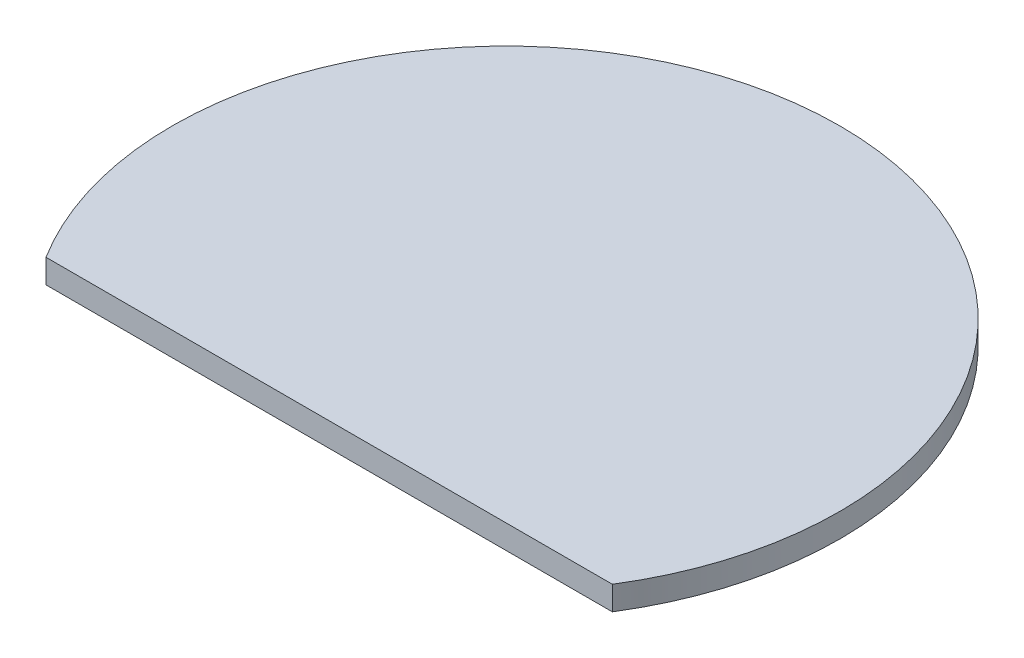
ISO-10303-21;
HEADER;
FILE_DESCRIPTION(('STEP AP214'),'2;1');
FILE_NAME('part.step','',(''),(''),'','','');
FILE_SCHEMA(('AUTOMOTIVE_DESIGN { 1 0 10303 214 1 1 1 1 }'));
ENDSEC;
DATA;
#1=APPLICATION_CONTEXT('core data for automotive mechanical design processes');
#2=APPLICATION_PROTOCOL_DEFINITION('international standard','automotive_design',2000,#1);
#3=PRODUCT_CONTEXT('',#1,'mechanical');
#4=PRODUCT('Part','Part','',(#3));
#5=PRODUCT_RELATED_PRODUCT_CATEGORY('part','',(#4));
#6=PRODUCT_DEFINITION_FORMATION('','',#4);
#7=PRODUCT_DEFINITION_CONTEXT('part definition',#1,'design');
#8=PRODUCT_DEFINITION('design','',#6,#7);
#9=PRODUCT_DEFINITION_SHAPE('','',#8);
#10=(LENGTH_UNIT() NAMED_UNIT(*) SI_UNIT(.MILLI.,.METRE.));
#11=(NAMED_UNIT(*) PLANE_ANGLE_UNIT() SI_UNIT($,.RADIAN.));
#12=(NAMED_UNIT(*) SI_UNIT($,.STERADIAN.) SOLID_ANGLE_UNIT());
#13=UNCERTAINTY_MEASURE_WITH_UNIT(LENGTH_MEASURE(1.E-05),#10,'distance_accuracy_value','');
#14=(GEOMETRIC_REPRESENTATION_CONTEXT(3) GLOBAL_UNCERTAINTY_ASSIGNED_CONTEXT((#13)) GLOBAL_UNIT_ASSIGNED_CONTEXT((#10,
#11,#12)) REPRESENTATION_CONTEXT('',''));
#15=CARTESIAN_POINT('',(0.,0.,0.));
#16=DIRECTION('',(0.,0.,1.));
#17=DIRECTION('',(1.,0.,0.));
#18=AXIS2_PLACEMENT_3D('',#15,#16,#17);
#19=CARTESIAN_POINT('',(0.,1.,0.));
#20=DIRECTION('',(0.,-1.,0.));
#21=DIRECTION('',(0.,0.,-1.));
#22=AXIS2_PLACEMENT_3D('',#19,#20,#21);
#23=CYLINDRICAL_SURFACE('',#22,13.96);
#24=CARTESIAN_POINT('',(0.,0.,0.));
#25=DIRECTION('',(0.,1.,0.));
#26=DIRECTION('',(0.,0.,1.));
#27=AXIS2_PLACEMENT_3D('',#24,#25,#26);
#28=CIRCLE('',#27,13.96);
#29=CARTESIAN_POINT('',(11.84,0.,7.39567441143809));
#30=VERTEX_POINT('',#29);
#31=CARTESIAN_POINT('',(-11.84,0.,7.39567441143809));
#32=VERTEX_POINT('',#31);
#33=EDGE_CURVE('E65',#30,#32,#28,.T.);
#34=ORIENTED_EDGE('',*,*,#33,.T.);
#35=DIRECTION('',(0.,-1.,0.));
#36=VECTOR('',#35,1.);
#37=CARTESIAN_POINT('',(-11.84,1.,7.39567441143809));
#38=LINE('',#37,#36);
#39=CARTESIAN_POINT('',(-11.84,1.,7.39567441143809));
#40=VERTEX_POINT('',#39);
#41=EDGE_CURVE('E11',#40,#32,#38,.T.);
#42=ORIENTED_EDGE('',*,*,#41,.F.);
#43=CARTESIAN_POINT('',(0.,1.,0.));
#44=DIRECTION('',(0.,1.,0.));
#45=DIRECTION('',(0.,0.,1.));
#46=AXIS2_PLACEMENT_3D('',#43,#44,#45);
#47=CIRCLE('',#46,13.96);
#48=CARTESIAN_POINT('',(11.84,1.,7.39567441143809));
#49=VERTEX_POINT('',#48);
#50=EDGE_CURVE('E64',#49,#40,#47,.T.);
#51=ORIENTED_EDGE('',*,*,#50,.F.);
#52=DIRECTION('',(0.,-1.,0.));
#53=VECTOR('',#52,1.);
#54=CARTESIAN_POINT('',(11.84,1.,7.39567441143809));
#55=LINE('',#54,#53);
#56=EDGE_CURVE('E42',#49,#30,#55,.T.);
#57=ORIENTED_EDGE('',*,*,#56,.T.);
#58=EDGE_LOOP('',(#34,#42,#51,#57));
#59=FACE_BOUND('',#58,.T.);
#60=ADVANCED_FACE('F34',(#59),#23,.T.);
#61=CARTESIAN_POINT('',(-11.84,1.,7.39567441143809));
#62=DIRECTION('',(0.,0.,-1.));
#63=DIRECTION('',(-1.,0.,0.));
#64=AXIS2_PLACEMENT_3D('',#61,#62,#63);
#65=PLANE('',#64);
#66=DIRECTION('',(1.,0.,0.));
#67=VECTOR('',#66,1.);
#68=CARTESIAN_POINT('',(-11.84,0.,7.39567441143809));
#69=LINE('',#68,#67);
#70=EDGE_CURVE('E57',#32,#30,#69,.T.);
#71=ORIENTED_EDGE('',*,*,#70,.T.);
#72=ORIENTED_EDGE('',*,*,#56,.F.);
#73=DIRECTION('',(1.,0.,0.));
#74=VECTOR('',#73,1.);
#75=CARTESIAN_POINT('',(-11.84,1.,7.39567441143809));
#76=LINE('',#75,#74);
#77=EDGE_CURVE('E49',#40,#49,#76,.T.);
#78=ORIENTED_EDGE('',*,*,#77,.F.);
#79=ORIENTED_EDGE('',*,*,#41,.T.);
#80=EDGE_LOOP('',(#71,#72,#78,#79));
#81=FACE_BOUND('',#80,.T.);
#82=ADVANCED_FACE('F60',(#81),#65,.F.);
#83=CARTESIAN_POINT('',(0.,1.,0.));
#84=DIRECTION('',(0.,1.,0.));
#85=DIRECTION('',(0.,0.,1.));
#86=AXIS2_PLACEMENT_3D('',#83,#84,#85);
#87=PLANE('',#86);
#88=ORIENTED_EDGE('',*,*,#50,.T.);
#89=ORIENTED_EDGE('',*,*,#77,.T.);
#90=EDGE_LOOP('',(#88,#89));
#91=FACE_BOUND('',#90,.T.);
#92=ADVANCED_FACE('F72',(#91),#87,.T.);
#93=CARTESIAN_POINT('',(0.,0.,0.));
#94=DIRECTION('',(0.,1.,0.));
#95=DIRECTION('',(0.,0.,1.));
#96=AXIS2_PLACEMENT_3D('',#93,#94,#95);
#97=PLANE('',#96);
#98=ORIENTED_EDGE('',*,*,#33,.F.);
#99=ORIENTED_EDGE('',*,*,#70,.F.);
#100=EDGE_LOOP('',(#98,#99));
#101=FACE_BOUND('',#100,.T.);
#102=ADVANCED_FACE('F68',(#101),#97,.F.);
#103=CLOSED_SHELL('',(#60,#82,#92,#102));
#104=MANIFOLD_SOLID_BREP('B2',#103);
#105=ADVANCED_BREP_SHAPE_REPRESENTATION('',(#18,#104),#14);
#106=SHAPE_DEFINITION_REPRESENTATION(#9,#105);
ENDSEC;
END-ISO-10303-21;
